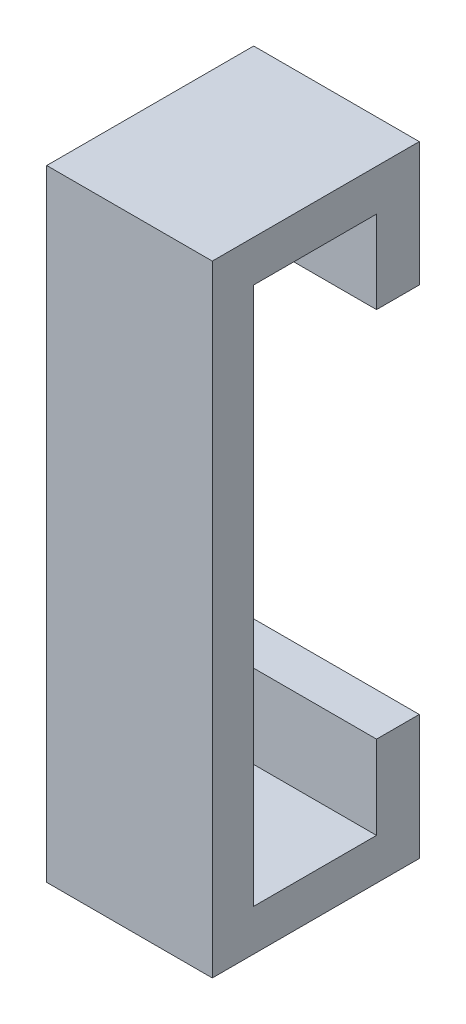
ISO-10303-21;
HEADER;
FILE_DESCRIPTION(('STEP AP214'),'2;1');
FILE_NAME('part.step','',(''),(''),'','','');
FILE_SCHEMA(('AUTOMOTIVE_DESIGN { 1 0 10303 214 1 1 1 1 }'));
ENDSEC;
DATA;
#1=APPLICATION_CONTEXT('core data for automotive mechanical design processes');
#2=APPLICATION_PROTOCOL_DEFINITION('international standard','automotive_design',2000,#1);
#3=PRODUCT_CONTEXT('',#1,'mechanical');
#4=PRODUCT('Part','Part','',(#3));
#5=PRODUCT_RELATED_PRODUCT_CATEGORY('part','',(#4));
#6=PRODUCT_DEFINITION_FORMATION('','',#4);
#7=PRODUCT_DEFINITION_CONTEXT('part definition',#1,'design');
#8=PRODUCT_DEFINITION('design','',#6,#7);
#9=PRODUCT_DEFINITION_SHAPE('','',#8);
#10=(LENGTH_UNIT() NAMED_UNIT(*) SI_UNIT(.MILLI.,.METRE.));
#11=(NAMED_UNIT(*) PLANE_ANGLE_UNIT() SI_UNIT($,.RADIAN.));
#12=(NAMED_UNIT(*) SI_UNIT($,.STERADIAN.) SOLID_ANGLE_UNIT());
#13=UNCERTAINTY_MEASURE_WITH_UNIT(LENGTH_MEASURE(1.E-05),#10,'distance_accuracy_value','');
#14=(GEOMETRIC_REPRESENTATION_CONTEXT(3) GLOBAL_UNCERTAINTY_ASSIGNED_CONTEXT((#13)) GLOBAL_UNIT_ASSIGNED_CONTEXT((#10,
#11,#12)) REPRESENTATION_CONTEXT('',''));
#15=CARTESIAN_POINT('',(0.,0.,0.));
#16=DIRECTION('',(0.,0.,1.));
#17=DIRECTION('',(1.,0.,0.));
#18=AXIS2_PLACEMENT_3D('',#15,#16,#17);
#19=CARTESIAN_POINT('',(10.16,0.,0.));
#20=DIRECTION('',(0.,0.,1.));
#21=DIRECTION('',(1.,0.,0.));
#22=AXIS2_PLACEMENT_3D('',#19,#20,#21);
#23=PLANE('',#22);
#24=DIRECTION('',(0.,1.,0.));
#25=VECTOR('',#24,1.);
#26=CARTESIAN_POINT('',(10.16,0.,0.));
#27=LINE('',#26,#25);
#28=CARTESIAN_POINT('',(10.16,30.48,0.));
#29=VERTEX_POINT('',#28);
#30=CARTESIAN_POINT('',(10.16,38.1,0.));
#31=VERTEX_POINT('',#30);
#32=EDGE_CURVE('E235',#29,#31,#27,.T.);
#33=ORIENTED_EDGE('',*,*,#32,.F.);
#34=DIRECTION('',(1.,0.,0.));
#35=VECTOR('',#34,1.);
#36=CARTESIAN_POINT('',(0.,30.48,0.));
#37=LINE('',#36,#35);
#38=CARTESIAN_POINT('',(0.,30.48,0.));
#39=VERTEX_POINT('',#38);
#40=EDGE_CURVE('E224',#39,#29,#37,.T.);
#41=ORIENTED_EDGE('',*,*,#40,.F.);
#42=DIRECTION('',(0.,1.,0.));
#43=VECTOR('',#42,1.);
#44=CARTESIAN_POINT('',(0.,0.,0.));
#45=LINE('',#44,#43);
#46=CARTESIAN_POINT('',(0.,38.1,0.));
#47=VERTEX_POINT('',#46);
#48=EDGE_CURVE('E247',#39,#47,#45,.T.);
#49=ORIENTED_EDGE('',*,*,#48,.T.);
#50=DIRECTION('',(-1.,0.,0.));
#51=VECTOR('',#50,1.);
#52=CARTESIAN_POINT('',(10.16,38.1,0.));
#53=LINE('',#52,#51);
#54=EDGE_CURVE('E54',#31,#47,#53,.T.);
#55=ORIENTED_EDGE('',*,*,#54,.F.);
#56=EDGE_LOOP('',(#33,#41,#49,#55));
#57=FACE_BOUND('',#56,.T.);
#58=ADVANCED_FACE('F45',(#57),#23,.F.);
#59=CARTESIAN_POINT('',(10.16,0.,0.));
#60=DIRECTION('',(0.,1.,0.));
#61=DIRECTION('',(0.,0.,1.));
#62=AXIS2_PLACEMENT_3D('',#59,#60,#61);
#63=PLANE('',#62);
#64=DIRECTION('',(0.,0.,-1.));
#65=VECTOR('',#64,1.);
#66=CARTESIAN_POINT('',(0.,0.,0.));
#67=LINE('',#66,#65);
#68=CARTESIAN_POINT('',(0.,0.,12.7));
#69=VERTEX_POINT('',#68);
#70=CARTESIAN_POINT('',(0.,0.,0.));
#71=VERTEX_POINT('',#70);
#72=EDGE_CURVE('E214',#69,#71,#67,.T.);
#73=ORIENTED_EDGE('',*,*,#72,.T.);
#74=DIRECTION('',(-1.,0.,0.));
#75=VECTOR('',#74,1.);
#76=CARTESIAN_POINT('',(10.16,0.,0.));
#77=LINE('',#76,#75);
#78=CARTESIAN_POINT('',(10.16,0.,0.));
#79=VERTEX_POINT('',#78);
#80=EDGE_CURVE('E11',#79,#71,#77,.T.);
#81=ORIENTED_EDGE('',*,*,#80,.F.);
#82=DIRECTION('',(0.,0.,-1.));
#83=VECTOR('',#82,1.);
#84=CARTESIAN_POINT('',(10.16,0.,0.));
#85=LINE('',#84,#83);
#86=CARTESIAN_POINT('',(10.16,0.,12.7));
#87=VERTEX_POINT('',#86);
#88=EDGE_CURVE('E232',#87,#79,#85,.T.);
#89=ORIENTED_EDGE('',*,*,#88,.F.);
#90=DIRECTION('',(-1.,0.,0.));
#91=VECTOR('',#90,1.);
#92=CARTESIAN_POINT('',(10.16,0.,12.7));
#93=LINE('',#92,#91);
#94=EDGE_CURVE('E243',#87,#69,#93,.T.);
#95=ORIENTED_EDGE('',*,*,#94,.T.);
#96=EDGE_LOOP('',(#73,#81,#89,#95));
#97=FACE_BOUND('',#96,.T.);
#98=ADVANCED_FACE('F47',(#97),#63,.F.);
#99=CARTESIAN_POINT('',(0.,7.65639043496186,0.));
#100=VERTEX_POINT('',#99);
#101=EDGE_CURVE('E248',#71,#100,#45,.T.);
#102=ORIENTED_EDGE('',*,*,#101,.T.);
#103=DIRECTION('',(1.,0.,0.));
#104=VECTOR('',#103,1.);
#105=CARTESIAN_POINT('',(0.,7.65639043496186,0.));
#106=LINE('',#105,#104);
#107=CARTESIAN_POINT('',(10.16,7.65639043496186,0.));
#108=VERTEX_POINT('',#107);
#109=EDGE_CURVE('E227',#100,#108,#106,.T.);
#110=ORIENTED_EDGE('',*,*,#109,.T.);
#111=EDGE_CURVE('E98',#79,#108,#27,.T.);
#112=ORIENTED_EDGE('',*,*,#111,.F.);
#113=ORIENTED_EDGE('',*,*,#80,.T.);
#114=EDGE_LOOP('',(#102,#110,#112,#113));
#115=FACE_BOUND('',#114,.T.);
#116=ADVANCED_FACE('F286',(#115),#23,.F.);
#117=CARTESIAN_POINT('',(10.16,38.1,0.));
#118=DIRECTION('',(0.,-1.,0.));
#119=DIRECTION('',(0.,0.,-1.));
#120=AXIS2_PLACEMENT_3D('',#117,#118,#119);
#121=PLANE('',#120);
#122=DIRECTION('',(0.,0.,1.));
#123=VECTOR('',#122,1.);
#124=CARTESIAN_POINT('',(0.,38.1,0.));
#125=LINE('',#124,#123);
#126=CARTESIAN_POINT('',(0.,38.1,12.7));
#127=VERTEX_POINT('',#126);
#128=EDGE_CURVE('E252',#47,#127,#125,.T.);
#129=ORIENTED_EDGE('',*,*,#128,.T.);
#130=DIRECTION('',(-1.,0.,0.));
#131=VECTOR('',#130,1.);
#132=CARTESIAN_POINT('',(10.16,38.1,12.7));
#133=LINE('',#132,#131);
#134=CARTESIAN_POINT('',(10.16,38.1,12.7));
#135=VERTEX_POINT('',#134);
#136=EDGE_CURVE('E259',#135,#127,#133,.T.);
#137=ORIENTED_EDGE('',*,*,#136,.F.);
#138=DIRECTION('',(0.,0.,1.));
#139=VECTOR('',#138,1.);
#140=CARTESIAN_POINT('',(10.16,38.1,0.));
#141=LINE('',#140,#139);
#142=EDGE_CURVE('E238',#31,#135,#141,.T.);
#143=ORIENTED_EDGE('',*,*,#142,.F.);
#144=ORIENTED_EDGE('',*,*,#54,.T.);
#145=EDGE_LOOP('',(#129,#137,#143,#144));
#146=FACE_BOUND('',#145,.T.);
#147=ADVANCED_FACE('F267',(#146),#121,.F.);
#148=CARTESIAN_POINT('',(10.16,0.,12.7));
#149=DIRECTION('',(0.,0.,-1.));
#150=DIRECTION('',(-1.,0.,0.));
#151=AXIS2_PLACEMENT_3D('',#148,#149,#150);
#152=PLANE('',#151);
#153=DIRECTION('',(0.,-1.,0.));
#154=VECTOR('',#153,1.);
#155=CARTESIAN_POINT('',(0.,0.,12.7));
#156=LINE('',#155,#154);
#157=EDGE_CURVE('E91',#127,#69,#156,.T.);
#158=ORIENTED_EDGE('',*,*,#157,.T.);
#159=ORIENTED_EDGE('',*,*,#94,.F.);
#160=DIRECTION('',(0.,-1.,0.));
#161=VECTOR('',#160,1.);
#162=CARTESIAN_POINT('',(10.16,0.,12.7));
#163=LINE('',#162,#161);
#164=EDGE_CURVE('E70',#135,#87,#163,.T.);
#165=ORIENTED_EDGE('',*,*,#164,.F.);
#166=ORIENTED_EDGE('',*,*,#136,.T.);
#167=EDGE_LOOP('',(#158,#159,#165,#166));
#168=FACE_BOUND('',#167,.T.);
#169=ADVANCED_FACE('F276',(#168),#152,.F.);
#170=CARTESIAN_POINT('',(10.16,0.,0.));
#171=DIRECTION('',(-1.,0.,0.));
#172=DIRECTION('',(0.,0.,1.));
#173=AXIS2_PLACEMENT_3D('',#170,#171,#172);
#174=PLANE('',#173);
#175=DIRECTION('',(0.,1.,0.));
#176=VECTOR('',#175,1.);
#177=CARTESIAN_POINT('',(10.16,35.56,2.62194392908682));
#178=LINE('',#177,#176);
#179=CARTESIAN_POINT('',(10.16,30.48,2.62194392908682));
#180=VERTEX_POINT('',#179);
#181=CARTESIAN_POINT('',(10.16,35.56,2.62194392908682));
#182=VERTEX_POINT('',#181);
#183=EDGE_CURVE('E204',#180,#182,#178,.T.);
#184=ORIENTED_EDGE('',*,*,#183,.F.);
#185=DIRECTION('',(0.,0.,1.));
#186=VECTOR('',#185,1.);
#187=CARTESIAN_POINT('',(10.16,30.48,0.));
#188=LINE('',#187,#186);
#189=EDGE_CURVE('E200',#29,#180,#188,.T.);
#190=ORIENTED_EDGE('',*,*,#189,.F.);
#191=ORIENTED_EDGE('',*,*,#32,.T.);
#192=ORIENTED_EDGE('',*,*,#142,.T.);
#193=ORIENTED_EDGE('',*,*,#164,.T.);
#194=ORIENTED_EDGE('',*,*,#88,.T.);
#195=ORIENTED_EDGE('',*,*,#111,.T.);
#196=DIRECTION('',(0.,0.,-1.));
#197=VECTOR('',#196,1.);
#198=CARTESIAN_POINT('',(10.16,7.65639043496186,2.62194392908682));
#199=LINE('',#198,#197);
#200=CARTESIAN_POINT('',(10.16,7.65639043496186,2.62194392908682));
#201=VERTEX_POINT('',#200);
#202=EDGE_CURVE('E197',#201,#108,#199,.T.);
#203=ORIENTED_EDGE('',*,*,#202,.F.);
#204=DIRECTION('',(0.,1.,0.));
#205=VECTOR('',#204,1.);
#206=CARTESIAN_POINT('',(10.16,2.54,2.62194392908682));
#207=LINE('',#206,#205);
#208=CARTESIAN_POINT('',(10.16,2.54,2.62194392908682));
#209=VERTEX_POINT('',#208);
#210=EDGE_CURVE('E194',#209,#201,#207,.T.);
#211=ORIENTED_EDGE('',*,*,#210,.F.);
#212=DIRECTION('',(0.,0.,-1.));
#213=VECTOR('',#212,1.);
#214=CARTESIAN_POINT('',(10.16,2.54,10.16));
#215=LINE('',#214,#213);
#216=CARTESIAN_POINT('',(10.16,2.54,10.16));
#217=VERTEX_POINT('',#216);
#218=EDGE_CURVE('E152',#217,#209,#215,.T.);
#219=ORIENTED_EDGE('',*,*,#218,.F.);
#220=DIRECTION('',(0.,-1.,0.));
#221=VECTOR('',#220,1.);
#222=CARTESIAN_POINT('',(10.16,2.54,10.16));
#223=LINE('',#222,#221);
#224=CARTESIAN_POINT('',(10.16,35.56,10.16));
#225=VERTEX_POINT('',#224);
#226=EDGE_CURVE('E171',#225,#217,#223,.T.);
#227=ORIENTED_EDGE('',*,*,#226,.F.);
#228=DIRECTION('',(0.,0.,1.));
#229=VECTOR('',#228,1.);
#230=CARTESIAN_POINT('',(10.16,35.56,10.16));
#231=LINE('',#230,#229);
#232=EDGE_CURVE('E175',#182,#225,#231,.T.);
#233=ORIENTED_EDGE('',*,*,#232,.F.);
#234=EDGE_LOOP('',(#184,#190,#191,#192,#193,#194,#195,#203,#211,#219,#227,#233));
#235=FACE_BOUND('',#234,.T.);
#236=ADVANCED_FACE('F278',(#235),#174,.F.);
#237=CARTESIAN_POINT('',(0.,0.,0.));
#238=DIRECTION('',(-1.,0.,0.));
#239=DIRECTION('',(0.,0.,1.));
#240=AXIS2_PLACEMENT_3D('',#237,#238,#239);
#241=PLANE('',#240);
#242=DIRECTION('',(0.,0.,1.));
#243=VECTOR('',#242,1.);
#244=CARTESIAN_POINT('',(0.,30.48,0.));
#245=LINE('',#244,#243);
#246=CARTESIAN_POINT('',(0.,30.48,2.62194392908682));
#247=VERTEX_POINT('',#246);
#248=EDGE_CURVE('E180',#39,#247,#245,.T.);
#249=ORIENTED_EDGE('',*,*,#248,.T.);
#250=DIRECTION('',(0.,1.,0.));
#251=VECTOR('',#250,1.);
#252=CARTESIAN_POINT('',(0.,35.56,2.62194392908682));
#253=LINE('',#252,#251);
#254=CARTESIAN_POINT('',(0.,35.56,2.62194392908682));
#255=VERTEX_POINT('',#254);
#256=EDGE_CURVE('E183',#247,#255,#253,.T.);
#257=ORIENTED_EDGE('',*,*,#256,.T.);
#258=DIRECTION('',(0.,0.,1.));
#259=VECTOR('',#258,1.);
#260=CARTESIAN_POINT('',(0.,35.56,10.16));
#261=LINE('',#260,#259);
#262=CARTESIAN_POINT('',(0.,35.56,10.16));
#263=VERTEX_POINT('',#262);
#264=EDGE_CURVE('E187',#255,#263,#261,.T.);
#265=ORIENTED_EDGE('',*,*,#264,.T.);
#266=DIRECTION('',(0.,-1.,0.));
#267=VECTOR('',#266,1.);
#268=CARTESIAN_POINT('',(0.,2.54,10.16));
#269=LINE('',#268,#267);
#270=CARTESIAN_POINT('',(0.,2.54,10.16));
#271=VERTEX_POINT('',#270);
#272=EDGE_CURVE('E158',#263,#271,#269,.T.);
#273=ORIENTED_EDGE('',*,*,#272,.T.);
#274=DIRECTION('',(0.,0.,-1.));
#275=VECTOR('',#274,1.);
#276=CARTESIAN_POINT('',(0.,2.54,10.16));
#277=LINE('',#276,#275);
#278=CARTESIAN_POINT('',(0.,2.54,2.62194392908682));
#279=VERTEX_POINT('',#278);
#280=EDGE_CURVE('E149',#271,#279,#277,.T.);
#281=ORIENTED_EDGE('',*,*,#280,.T.);
#282=DIRECTION('',(0.,1.,0.));
#283=VECTOR('',#282,1.);
#284=CARTESIAN_POINT('',(0.,2.54,2.62194392908682));
#285=LINE('',#284,#283);
#286=CARTESIAN_POINT('',(0.,7.65639043496186,2.62194392908682));
#287=VERTEX_POINT('',#286);
#288=EDGE_CURVE('E161',#279,#287,#285,.T.);
#289=ORIENTED_EDGE('',*,*,#288,.T.);
#290=DIRECTION('',(0.,0.,-1.));
#291=VECTOR('',#290,1.);
#292=CARTESIAN_POINT('',(0.,7.65639043496186,2.62194392908682));
#293=LINE('',#292,#291);
#294=EDGE_CURVE('E61',#287,#100,#293,.T.);
#295=ORIENTED_EDGE('',*,*,#294,.T.);
#296=ORIENTED_EDGE('',*,*,#101,.F.);
#297=ORIENTED_EDGE('',*,*,#72,.F.);
#298=ORIENTED_EDGE('',*,*,#157,.F.);
#299=ORIENTED_EDGE('',*,*,#128,.F.);
#300=ORIENTED_EDGE('',*,*,#48,.F.);
#301=EDGE_LOOP('',(#249,#257,#265,#273,#281,#289,#295,#296,#297,#298,#299,#300));
#302=FACE_BOUND('',#301,.T.);
#303=ADVANCED_FACE('F167',(#302),#241,.T.);
#304=CARTESIAN_POINT('',(0.,2.54,10.16));
#305=DIRECTION('',(0.,-1.,0.));
#306=DIRECTION('',(0.,0.,-1.));
#307=AXIS2_PLACEMENT_3D('',#304,#305,#306);
#308=PLANE('',#307);
#309=ORIENTED_EDGE('',*,*,#218,.T.);
#310=DIRECTION('',(1.,0.,0.));
#311=VECTOR('',#310,1.);
#312=CARTESIAN_POINT('',(0.,2.54,2.62194392908682));
#313=LINE('',#312,#311);
#314=EDGE_CURVE('E145',#279,#209,#313,.T.);
#315=ORIENTED_EDGE('',*,*,#314,.F.);
#316=ORIENTED_EDGE('',*,*,#280,.F.);
#317=DIRECTION('',(1.,0.,0.));
#318=VECTOR('',#317,1.);
#319=CARTESIAN_POINT('',(0.,2.54,10.16));
#320=LINE('',#319,#318);
#321=EDGE_CURVE('E211',#271,#217,#320,.T.);
#322=ORIENTED_EDGE('',*,*,#321,.T.);
#323=EDGE_LOOP('',(#309,#315,#316,#322));
#324=FACE_BOUND('',#323,.T.);
#325=ADVANCED_FACE('F147',(#324),#308,.F.);
#326=CARTESIAN_POINT('',(0.,2.54,10.16));
#327=DIRECTION('',(0.,0.,1.));
#328=DIRECTION('',(1.,0.,0.));
#329=AXIS2_PLACEMENT_3D('',#326,#327,#328);
#330=PLANE('',#329);
#331=ORIENTED_EDGE('',*,*,#226,.T.);
#332=ORIENTED_EDGE('',*,*,#321,.F.);
#333=ORIENTED_EDGE('',*,*,#272,.F.);
#334=DIRECTION('',(1.,0.,0.));
#335=VECTOR('',#334,1.);
#336=CARTESIAN_POINT('',(0.,35.56,10.16));
#337=LINE('',#336,#335);
#338=EDGE_CURVE('E215',#263,#225,#337,.T.);
#339=ORIENTED_EDGE('',*,*,#338,.T.);
#340=EDGE_LOOP('',(#331,#332,#333,#339));
#341=FACE_BOUND('',#340,.T.);
#342=ADVANCED_FACE('F312',(#341),#330,.F.);
#343=CARTESIAN_POINT('',(0.,35.56,10.16));
#344=DIRECTION('',(0.,1.,0.));
#345=DIRECTION('',(0.,0.,1.));
#346=AXIS2_PLACEMENT_3D('',#343,#344,#345);
#347=PLANE('',#346);
#348=ORIENTED_EDGE('',*,*,#232,.T.);
#349=ORIENTED_EDGE('',*,*,#338,.F.);
#350=ORIENTED_EDGE('',*,*,#264,.F.);
#351=DIRECTION('',(1.,0.,0.));
#352=VECTOR('',#351,1.);
#353=CARTESIAN_POINT('',(0.,35.56,2.62194392908682));
#354=LINE('',#353,#352);
#355=EDGE_CURVE('E218',#255,#182,#354,.T.);
#356=ORIENTED_EDGE('',*,*,#355,.T.);
#357=EDGE_LOOP('',(#348,#349,#350,#356));
#358=FACE_BOUND('',#357,.T.);
#359=ADVANCED_FACE('F331',(#358),#347,.F.);
#360=CARTESIAN_POINT('',(0.,35.56,2.62194392908682));
#361=DIRECTION('',(0.,0.,-1.));
#362=DIRECTION('',(0.,1.,0.));
#363=AXIS2_PLACEMENT_3D('',#360,#361,#362);
#364=PLANE('',#363);
#365=ORIENTED_EDGE('',*,*,#183,.T.);
#366=ORIENTED_EDGE('',*,*,#355,.F.);
#367=ORIENTED_EDGE('',*,*,#256,.F.);
#368=DIRECTION('',(1.,0.,0.));
#369=VECTOR('',#368,1.);
#370=CARTESIAN_POINT('',(0.,30.48,2.62194392908682));
#371=LINE('',#370,#369);
#372=EDGE_CURVE('E221',#247,#180,#371,.T.);
#373=ORIENTED_EDGE('',*,*,#372,.T.);
#374=EDGE_LOOP('',(#365,#366,#367,#373));
#375=FACE_BOUND('',#374,.T.);
#376=ADVANCED_FACE('F306',(#375),#364,.F.);
#377=CARTESIAN_POINT('',(0.,30.48,0.));
#378=DIRECTION('',(0.,1.,0.));
#379=DIRECTION('',(0.,0.,1.));
#380=AXIS2_PLACEMENT_3D('',#377,#378,#379);
#381=PLANE('',#380);
#382=ORIENTED_EDGE('',*,*,#189,.T.);
#383=ORIENTED_EDGE('',*,*,#372,.F.);
#384=ORIENTED_EDGE('',*,*,#248,.F.);
#385=ORIENTED_EDGE('',*,*,#40,.T.);
#386=EDGE_LOOP('',(#382,#383,#384,#385));
#387=FACE_BOUND('',#386,.T.);
#388=ADVANCED_FACE('F299',(#387),#381,.F.);
#389=CARTESIAN_POINT('',(0.,7.65639043496186,2.62194392908682));
#390=DIRECTION('',(0.,-1.,0.));
#391=DIRECTION('',(0.,0.,-1.));
#392=AXIS2_PLACEMENT_3D('',#389,#390,#391);
#393=PLANE('',#392);
#394=ORIENTED_EDGE('',*,*,#202,.T.);
#395=ORIENTED_EDGE('',*,*,#109,.F.);
#396=ORIENTED_EDGE('',*,*,#294,.F.);
#397=DIRECTION('',(1.,0.,0.));
#398=VECTOR('',#397,1.);
#399=CARTESIAN_POINT('',(0.,7.65639043496186,2.62194392908682));
#400=LINE('',#399,#398);
#401=EDGE_CURVE('E157',#287,#201,#400,.T.);
#402=ORIENTED_EDGE('',*,*,#401,.T.);
#403=EDGE_LOOP('',(#394,#395,#396,#402));
#404=FACE_BOUND('',#403,.T.);
#405=ADVANCED_FACE('F297',(#404),#393,.F.);
#406=CARTESIAN_POINT('',(0.,2.54,2.62194392908682));
#407=DIRECTION('',(0.,0.,-1.));
#408=DIRECTION('',(-1.,0.,0.));
#409=AXIS2_PLACEMENT_3D('',#406,#407,#408);
#410=PLANE('',#409);
#411=ORIENTED_EDGE('',*,*,#210,.T.);
#412=ORIENTED_EDGE('',*,*,#401,.F.);
#413=ORIENTED_EDGE('',*,*,#288,.F.);
#414=ORIENTED_EDGE('',*,*,#314,.T.);
#415=EDGE_LOOP('',(#411,#412,#413,#414));
#416=FACE_BOUND('',#415,.T.);
#417=ADVANCED_FACE('F162',(#416),#410,.F.);
#418=CLOSED_SHELL('',(#58,#98,#116,#147,#169,#236,#303,#325,#342,#359,#376,#388,#405,#417));
#419=MANIFOLD_SOLID_BREP('B2',#418);
#420=ADVANCED_BREP_SHAPE_REPRESENTATION('',(#18,#419),#14);
#421=SHAPE_DEFINITION_REPRESENTATION(#9,#420);
ENDSEC;
END-ISO-10303-21;
